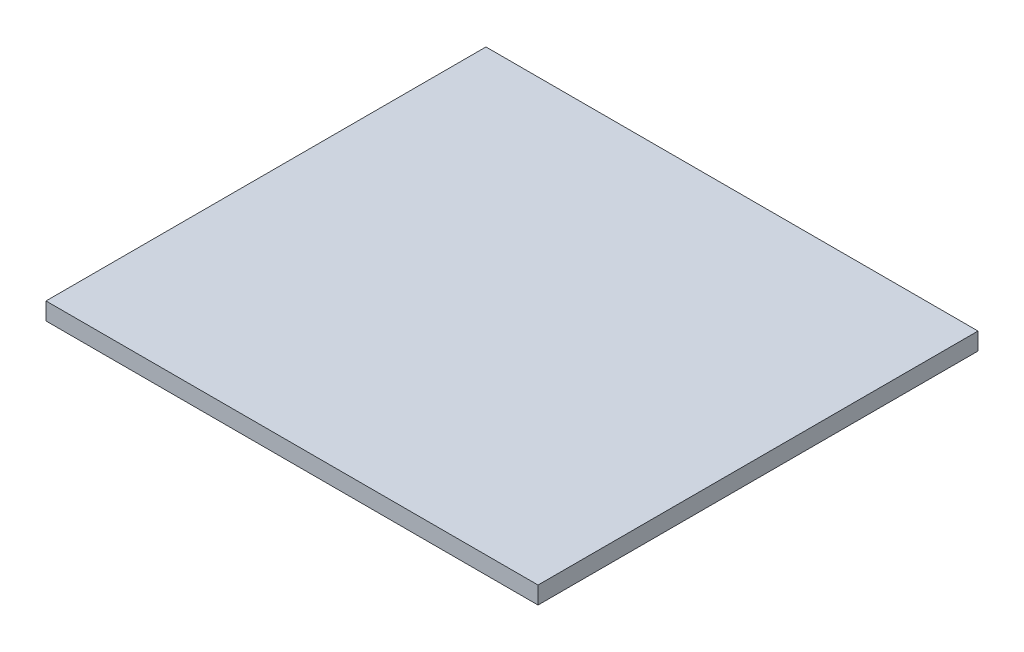
ISO-10303-21;
HEADER;
FILE_DESCRIPTION(('STEP AP214'),'2;1');
FILE_NAME('part.step','',(''),(''),'','','');
FILE_SCHEMA(('AUTOMOTIVE_DESIGN { 1 0 10303 214 1 1 1 1 }'));
ENDSEC;
DATA;
#1=APPLICATION_CONTEXT('core data for automotive mechanical design processes');
#2=APPLICATION_PROTOCOL_DEFINITION('international standard','automotive_design',2000,#1);
#3=PRODUCT_CONTEXT('',#1,'mechanical');
#4=PRODUCT('Part','Part','',(#3));
#5=PRODUCT_RELATED_PRODUCT_CATEGORY('part','',(#4));
#6=PRODUCT_DEFINITION_FORMATION('','',#4);
#7=PRODUCT_DEFINITION_CONTEXT('part definition',#1,'design');
#8=PRODUCT_DEFINITION('design','',#6,#7);
#9=PRODUCT_DEFINITION_SHAPE('','',#8);
#10=(LENGTH_UNIT() NAMED_UNIT(*) SI_UNIT(.MILLI.,.METRE.));
#11=(NAMED_UNIT(*) PLANE_ANGLE_UNIT() SI_UNIT($,.RADIAN.));
#12=(NAMED_UNIT(*) SI_UNIT($,.STERADIAN.) SOLID_ANGLE_UNIT());
#13=UNCERTAINTY_MEASURE_WITH_UNIT(LENGTH_MEASURE(1.E-05),#10,'distance_accuracy_value','');
#14=(GEOMETRIC_REPRESENTATION_CONTEXT(3) GLOBAL_UNCERTAINTY_ASSIGNED_CONTEXT((#13)) GLOBAL_UNIT_ASSIGNED_CONTEXT((#10,
#11,#12)) REPRESENTATION_CONTEXT('',''));
#15=CARTESIAN_POINT('',(0.,0.,0.));
#16=DIRECTION('',(0.,0.,1.));
#17=DIRECTION('',(1.,0.,0.));
#18=AXIS2_PLACEMENT_3D('',#15,#16,#17);
#19=CARTESIAN_POINT('',(42.5,3.,38.));
#20=DIRECTION('',(-1.,0.,0.));
#21=DIRECTION('',(0.,0.,1.));
#22=AXIS2_PLACEMENT_3D('',#19,#20,#21);
#23=PLANE('',#22);
#24=DIRECTION('',(0.,0.,-1.));
#25=VECTOR('',#24,1.);
#26=CARTESIAN_POINT('',(42.5,0.,38.));
#27=LINE('',#26,#25);
#28=CARTESIAN_POINT('',(42.5,0.,38.));
#29=VERTEX_POINT('',#28);
#30=CARTESIAN_POINT('',(42.5,0.,-38.));
#31=VERTEX_POINT('',#30);
#32=EDGE_CURVE('E109',#29,#31,#27,.T.);
#33=ORIENTED_EDGE('',*,*,#32,.T.);
#34=DIRECTION('',(0.,-1.,0.));
#35=VECTOR('',#34,1.);
#36=CARTESIAN_POINT('',(42.5,3.,-38.));
#37=LINE('',#36,#35);
#38=CARTESIAN_POINT('',(42.5,3.,-38.));
#39=VERTEX_POINT('',#38);
#40=EDGE_CURVE('E11',#39,#31,#37,.T.);
#41=ORIENTED_EDGE('',*,*,#40,.F.);
#42=DIRECTION('',(0.,0.,-1.));
#43=VECTOR('',#42,1.);
#44=CARTESIAN_POINT('',(42.5,3.,38.));
#45=LINE('',#44,#43);
#46=CARTESIAN_POINT('',(42.5,3.,38.));
#47=VERTEX_POINT('',#46);
#48=EDGE_CURVE('E93',#47,#39,#45,.T.);
#49=ORIENTED_EDGE('',*,*,#48,.F.);
#50=DIRECTION('',(0.,-1.,0.));
#51=VECTOR('',#50,1.);
#52=CARTESIAN_POINT('',(42.5,3.,38.));
#53=LINE('',#52,#51);
#54=EDGE_CURVE('E105',#47,#29,#53,.T.);
#55=ORIENTED_EDGE('',*,*,#54,.T.);
#56=EDGE_LOOP('',(#33,#41,#49,#55));
#57=FACE_BOUND('',#56,.T.);
#58=ADVANCED_FACE('F41',(#57),#23,.F.);
#59=CARTESIAN_POINT('',(-42.5,3.,-38.));
#60=DIRECTION('',(0.,0.,1.));
#61=DIRECTION('',(1.,0.,0.));
#62=AXIS2_PLACEMENT_3D('',#59,#60,#61);
#63=PLANE('',#62);
#64=DIRECTION('',(-1.,0.,0.));
#65=VECTOR('',#64,1.);
#66=CARTESIAN_POINT('',(-42.5,0.,-38.));
#67=LINE('',#66,#65);
#68=CARTESIAN_POINT('',(-42.5,0.,-38.));
#69=VERTEX_POINT('',#68);
#70=EDGE_CURVE('E98',#31,#69,#67,.T.);
#71=ORIENTED_EDGE('',*,*,#70,.T.);
#72=DIRECTION('',(0.,-1.,0.));
#73=VECTOR('',#72,1.);
#74=CARTESIAN_POINT('',(-42.5,3.,-38.));
#75=LINE('',#74,#73);
#76=CARTESIAN_POINT('',(-42.5,3.,-38.));
#77=VERTEX_POINT('',#76);
#78=EDGE_CURVE('E50',#77,#69,#75,.T.);
#79=ORIENTED_EDGE('',*,*,#78,.F.);
#80=DIRECTION('',(-1.,0.,0.));
#81=VECTOR('',#80,1.);
#82=CARTESIAN_POINT('',(-42.5,3.,-38.));
#83=LINE('',#82,#81);
#84=EDGE_CURVE('E88',#39,#77,#83,.T.);
#85=ORIENTED_EDGE('',*,*,#84,.F.);
#86=ORIENTED_EDGE('',*,*,#40,.T.);
#87=EDGE_LOOP('',(#71,#79,#85,#86));
#88=FACE_BOUND('',#87,.T.);
#89=ADVANCED_FACE('F97',(#88),#63,.F.);
#90=CARTESIAN_POINT('',(-42.5,3.,38.));
#91=DIRECTION('',(1.,0.,0.));
#92=DIRECTION('',(0.,0.,-1.));
#93=AXIS2_PLACEMENT_3D('',#90,#91,#92);
#94=PLANE('',#93);
#95=DIRECTION('',(0.,0.,1.));
#96=VECTOR('',#95,1.);
#97=CARTESIAN_POINT('',(-42.5,0.,38.));
#98=LINE('',#97,#96);
#99=CARTESIAN_POINT('',(-42.5,0.,38.));
#100=VERTEX_POINT('',#99);
#101=EDGE_CURVE('E75',#69,#100,#98,.T.);
#102=ORIENTED_EDGE('',*,*,#101,.T.);
#103=DIRECTION('',(0.,-1.,0.));
#104=VECTOR('',#103,1.);
#105=CARTESIAN_POINT('',(-42.5,3.,38.));
#106=LINE('',#105,#104);
#107=CARTESIAN_POINT('',(-42.5,3.,38.));
#108=VERTEX_POINT('',#107);
#109=EDGE_CURVE('E100',#108,#100,#106,.T.);
#110=ORIENTED_EDGE('',*,*,#109,.F.);
#111=DIRECTION('',(0.,0.,1.));
#112=VECTOR('',#111,1.);
#113=CARTESIAN_POINT('',(-42.5,3.,38.));
#114=LINE('',#113,#112);
#115=EDGE_CURVE('E91',#77,#108,#114,.T.);
#116=ORIENTED_EDGE('',*,*,#115,.F.);
#117=ORIENTED_EDGE('',*,*,#78,.T.);
#118=EDGE_LOOP('',(#102,#110,#116,#117));
#119=FACE_BOUND('',#118,.T.);
#120=ADVANCED_FACE('F101',(#119),#94,.F.);
#121=CARTESIAN_POINT('',(-42.5,3.,38.));
#122=DIRECTION('',(0.,0.,-1.));
#123=DIRECTION('',(-1.,0.,0.));
#124=AXIS2_PLACEMENT_3D('',#121,#122,#123);
#125=PLANE('',#124);
#126=DIRECTION('',(1.,0.,0.));
#127=VECTOR('',#126,1.);
#128=CARTESIAN_POINT('',(-42.5,0.,38.));
#129=LINE('',#128,#127);
#130=EDGE_CURVE('E81',#100,#29,#129,.T.);
#131=ORIENTED_EDGE('',*,*,#130,.T.);
#132=ORIENTED_EDGE('',*,*,#54,.F.);
#133=DIRECTION('',(1.,0.,0.));
#134=VECTOR('',#133,1.);
#135=CARTESIAN_POINT('',(-42.5,3.,38.));
#136=LINE('',#135,#134);
#137=EDGE_CURVE('E58',#108,#47,#136,.T.);
#138=ORIENTED_EDGE('',*,*,#137,.F.);
#139=ORIENTED_EDGE('',*,*,#109,.T.);
#140=EDGE_LOOP('',(#131,#132,#138,#139));
#141=FACE_BOUND('',#140,.T.);
#142=ADVANCED_FACE('F122',(#141),#125,.F.);
#143=CARTESIAN_POINT('',(0.,3.,0.));
#144=DIRECTION('',(0.,-1.,0.));
#145=DIRECTION('',(0.,0.,-1.));
#146=AXIS2_PLACEMENT_3D('',#143,#144,#145);
#147=PLANE('',#146);
#148=ORIENTED_EDGE('',*,*,#48,.T.);
#149=ORIENTED_EDGE('',*,*,#84,.T.);
#150=ORIENTED_EDGE('',*,*,#115,.T.);
#151=ORIENTED_EDGE('',*,*,#137,.T.);
#152=EDGE_LOOP('',(#148,#149,#150,#151));
#153=FACE_BOUND('',#152,.T.);
#154=ADVANCED_FACE('F89',(#153),#147,.F.);
#155=CARTESIAN_POINT('',(0.,0.,0.));
#156=DIRECTION('',(0.,-1.,0.));
#157=DIRECTION('',(0.,0.,-1.));
#158=AXIS2_PLACEMENT_3D('',#155,#156,#157);
#159=PLANE('',#158);
#160=ORIENTED_EDGE('',*,*,#32,.F.);
#161=ORIENTED_EDGE('',*,*,#130,.F.);
#162=ORIENTED_EDGE('',*,*,#101,.F.);
#163=ORIENTED_EDGE('',*,*,#70,.F.);
#164=EDGE_LOOP('',(#160,#161,#162,#163));
#165=FACE_BOUND('',#164,.T.);
#166=ADVANCED_FACE('F125',(#165),#159,.T.);
#167=CLOSED_SHELL('',(#58,#89,#120,#142,#154,#166));
#168=MANIFOLD_SOLID_BREP('B2',#167);
#169=ADVANCED_BREP_SHAPE_REPRESENTATION('',(#18,#168),#14);
#170=SHAPE_DEFINITION_REPRESENTATION(#9,#169);
ENDSEC;
END-ISO-10303-21;
